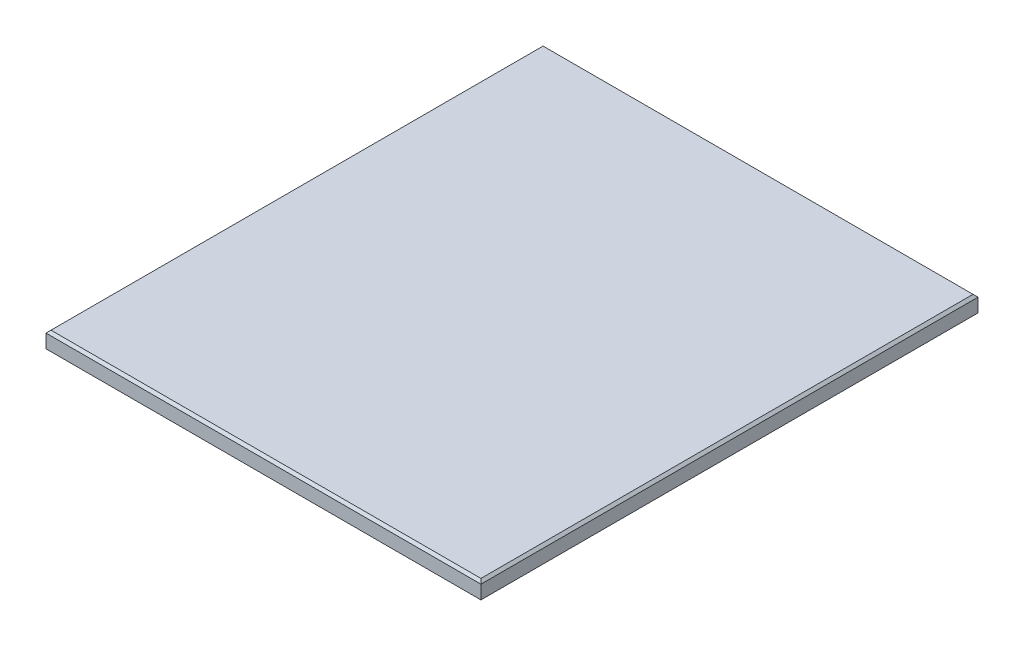
ISO-10303-21;
HEADER;
FILE_DESCRIPTION(('STEP AP214'),'2;1');
FILE_NAME('part.step','',(''),(''),'','','');
FILE_SCHEMA(('AUTOMOTIVE_DESIGN { 1 0 10303 214 1 1 1 1 }'));
ENDSEC;
DATA;
#1=APPLICATION_CONTEXT('core data for automotive mechanical design processes');
#2=APPLICATION_PROTOCOL_DEFINITION('international standard','automotive_design',2000,#1);
#3=PRODUCT_CONTEXT('',#1,'mechanical');
#4=PRODUCT('Part','Part','',(#3));
#5=PRODUCT_RELATED_PRODUCT_CATEGORY('part','',(#4));
#6=PRODUCT_DEFINITION_FORMATION('','',#4);
#7=PRODUCT_DEFINITION_CONTEXT('part definition',#1,'design');
#8=PRODUCT_DEFINITION('design','',#6,#7);
#9=PRODUCT_DEFINITION_SHAPE('','',#8);
#10=(LENGTH_UNIT() NAMED_UNIT(*) SI_UNIT(.MILLI.,.METRE.));
#11=(NAMED_UNIT(*) PLANE_ANGLE_UNIT() SI_UNIT($,.RADIAN.));
#12=(NAMED_UNIT(*) SI_UNIT($,.STERADIAN.) SOLID_ANGLE_UNIT());
#13=UNCERTAINTY_MEASURE_WITH_UNIT(LENGTH_MEASURE(1.E-05),#10,'distance_accuracy_value','');
#14=(GEOMETRIC_REPRESENTATION_CONTEXT(3) GLOBAL_UNCERTAINTY_ASSIGNED_CONTEXT((#13)) GLOBAL_UNIT_ASSIGNED_CONTEXT((#10,
#11,#12)) REPRESENTATION_CONTEXT('',''));
#15=CARTESIAN_POINT('',(0.,0.,0.));
#16=DIRECTION('',(0.,0.,1.));
#17=DIRECTION('',(1.,0.,0.));
#18=AXIS2_PLACEMENT_3D('',#15,#16,#17);
#19=CARTESIAN_POINT('',(0.,15.,0.));
#20=DIRECTION('',(1.,0.,0.));
#21=DIRECTION('',(0.,0.,-1.));
#22=AXIS2_PLACEMENT_3D('',#19,#20,#21);
#23=PLANE('',#22);
#24=DIRECTION('',(0.,-1.,0.));
#25=VECTOR('',#24,1.);
#26=CARTESIAN_POINT('',(0.,15.,0.));
#27=LINE('',#26,#25);
#28=CARTESIAN_POINT('',(0.,12.9999999999999,0.));
#29=VERTEX_POINT('',#28);
#30=CARTESIAN_POINT('',(0.,2.,0.));
#31=VERTEX_POINT('',#30);
#32=EDGE_CURVE('E141',#29,#31,#27,.T.);
#33=ORIENTED_EDGE('',*,*,#32,.T.);
#34=DIRECTION('',(0.,0.,1.));
#35=VECTOR('',#34,1.);
#36=CARTESIAN_POINT('',(0.,2.,0.));
#37=LINE('',#36,#35);
#38=CARTESIAN_POINT('',(0.,2.,400.));
#39=VERTEX_POINT('',#38);
#40=EDGE_CURVE('E150',#31,#39,#37,.T.);
#41=ORIENTED_EDGE('',*,*,#40,.T.);
#42=DIRECTION('',(0.,-1.,0.));
#43=VECTOR('',#42,1.);
#44=CARTESIAN_POINT('',(0.,15.,400.));
#45=LINE('',#44,#43);
#46=CARTESIAN_POINT('',(0.,12.9999999999999,400.));
#47=VERTEX_POINT('',#46);
#48=EDGE_CURVE('E119',#47,#39,#45,.T.);
#49=ORIENTED_EDGE('',*,*,#48,.F.);
#50=DIRECTION('',(0.,0.,-1.));
#51=VECTOR('',#50,1.);
#52=CARTESIAN_POINT('',(0.,12.9999999999999,0.));
#53=LINE('',#52,#51);
#54=EDGE_CURVE('E152',#47,#29,#53,.T.);
#55=ORIENTED_EDGE('',*,*,#54,.T.);
#56=EDGE_LOOP('',(#33,#41,#49,#55));
#57=FACE_BOUND('',#56,.T.);
#58=ADVANCED_FACE('F32',(#57),#23,.F.);
#59=CARTESIAN_POINT('',(0.,15.,400.));
#60=DIRECTION('',(0.,0.,-1.));
#61=DIRECTION('',(-1.,0.,0.));
#62=AXIS2_PLACEMENT_3D('',#59,#60,#61);
#63=PLANE('',#62);
#64=ORIENTED_EDGE('',*,*,#48,.T.);
#65=DIRECTION('',(1.,0.,0.));
#66=VECTOR('',#65,1.);
#67=CARTESIAN_POINT('',(0.,2.,400.));
#68=LINE('',#67,#66);
#69=CARTESIAN_POINT('',(350.,2.,400.));
#70=VERTEX_POINT('',#69);
#71=EDGE_CURVE('E118',#39,#70,#68,.T.);
#72=ORIENTED_EDGE('',*,*,#71,.T.);
#73=DIRECTION('',(0.,-1.,0.));
#74=VECTOR('',#73,1.);
#75=CARTESIAN_POINT('',(350.,15.,400.));
#76=LINE('',#75,#74);
#77=CARTESIAN_POINT('',(350.,12.9999999999999,400.));
#78=VERTEX_POINT('',#77);
#79=EDGE_CURVE('E101',#78,#70,#76,.T.);
#80=ORIENTED_EDGE('',*,*,#79,.F.);
#81=DIRECTION('',(-1.,0.,0.));
#82=VECTOR('',#81,1.);
#83=CARTESIAN_POINT('',(0.,12.9999999999999,400.));
#84=LINE('',#83,#82);
#85=EDGE_CURVE('E115',#78,#47,#84,.T.);
#86=ORIENTED_EDGE('',*,*,#85,.T.);
#87=EDGE_LOOP('',(#64,#72,#80,#86));
#88=FACE_BOUND('',#87,.T.);
#89=ADVANCED_FACE('F114',(#88),#63,.F.);
#90=CARTESIAN_POINT('',(350.,15.,0.));
#91=DIRECTION('',(-1.,0.,0.));
#92=DIRECTION('',(0.,0.,1.));
#93=AXIS2_PLACEMENT_3D('',#90,#91,#92);
#94=PLANE('',#93);
#95=ORIENTED_EDGE('',*,*,#79,.T.);
#96=DIRECTION('',(0.,0.,-1.));
#97=VECTOR('',#96,1.);
#98=CARTESIAN_POINT('',(350.,2.,0.));
#99=LINE('',#98,#97);
#100=CARTESIAN_POINT('',(350.,2.,0.));
#101=VERTEX_POINT('',#100);
#102=EDGE_CURVE('E107',#70,#101,#99,.T.);
#103=ORIENTED_EDGE('',*,*,#102,.T.);
#104=DIRECTION('',(0.,-1.,0.));
#105=VECTOR('',#104,1.);
#106=CARTESIAN_POINT('',(350.,15.,0.));
#107=LINE('',#106,#105);
#108=CARTESIAN_POINT('',(350.,12.9999999999999,0.));
#109=VERTEX_POINT('',#108);
#110=EDGE_CURVE('E103',#109,#101,#107,.T.);
#111=ORIENTED_EDGE('',*,*,#110,.F.);
#112=DIRECTION('',(0.,0.,1.));
#113=VECTOR('',#112,1.);
#114=CARTESIAN_POINT('',(350.,12.9999999999999,400.));
#115=LINE('',#114,#113);
#116=EDGE_CURVE('E98',#109,#78,#115,.T.);
#117=ORIENTED_EDGE('',*,*,#116,.T.);
#118=EDGE_LOOP('',(#95,#103,#111,#117));
#119=FACE_BOUND('',#118,.T.);
#120=ADVANCED_FACE('F100',(#119),#94,.F.);
#121=CARTESIAN_POINT('',(0.,15.,0.));
#122=DIRECTION('',(0.,0.,1.));
#123=DIRECTION('',(1.,0.,0.));
#124=AXIS2_PLACEMENT_3D('',#121,#122,#123);
#125=PLANE('',#124);
#126=ORIENTED_EDGE('',*,*,#110,.T.);
#127=DIRECTION('',(-1.,0.,0.));
#128=VECTOR('',#127,1.);
#129=CARTESIAN_POINT('',(0.,2.,0.));
#130=LINE('',#129,#128);
#131=EDGE_CURVE('E154',#101,#31,#130,.T.);
#132=ORIENTED_EDGE('',*,*,#131,.T.);
#133=ORIENTED_EDGE('',*,*,#32,.F.);
#134=DIRECTION('',(1.,0.,0.));
#135=VECTOR('',#134,1.);
#136=CARTESIAN_POINT('',(350.,12.9999999999999,0.));
#137=LINE('',#136,#135);
#138=EDGE_CURVE('E156',#29,#109,#137,.T.);
#139=ORIENTED_EDGE('',*,*,#138,.T.);
#140=EDGE_LOOP('',(#126,#132,#133,#139));
#141=FACE_BOUND('',#140,.T.);
#142=ADVANCED_FACE('F194',(#141),#125,.F.);
#143=CARTESIAN_POINT('',(0.,15.,0.));
#144=DIRECTION('',(0.,1.,0.));
#145=DIRECTION('',(0.,0.,1.));
#146=AXIS2_PLACEMENT_3D('',#143,#144,#145);
#147=PLANE('',#146);
#148=DIRECTION('',(0.,0.,-1.));
#149=VECTOR('',#148,1.);
#150=CARTESIAN_POINT('',(348.,15.,0.));
#151=LINE('',#150,#149);
#152=CARTESIAN_POINT('',(348.,15.,398.));
#153=VERTEX_POINT('',#152);
#154=CARTESIAN_POINT('',(348.,15.,2.00000000000006));
#155=VERTEX_POINT('',#154);
#156=EDGE_CURVE('E41',#153,#155,#151,.T.);
#157=ORIENTED_EDGE('',*,*,#156,.T.);
#158=DIRECTION('',(-1.,0.,0.));
#159=VECTOR('',#158,1.);
#160=CARTESIAN_POINT('',(0.,15.,2.00000000000006));
#161=LINE('',#160,#159);
#162=CARTESIAN_POINT('',(2.00000000000006,15.,2.00000000000006));
#163=VERTEX_POINT('',#162);
#164=EDGE_CURVE('E11',#155,#163,#161,.T.);
#165=ORIENTED_EDGE('',*,*,#164,.T.);
#166=DIRECTION('',(0.,0.,1.));
#167=VECTOR('',#166,1.);
#168=CARTESIAN_POINT('',(2.00000000000011,15.,400.));
#169=LINE('',#168,#167);
#170=CARTESIAN_POINT('',(2.00000000000011,15.,398.));
#171=VERTEX_POINT('',#170);
#172=EDGE_CURVE('E148',#163,#171,#169,.T.);
#173=ORIENTED_EDGE('',*,*,#172,.T.);
#174=DIRECTION('',(1.,0.,0.));
#175=VECTOR('',#174,1.);
#176=CARTESIAN_POINT('',(350.,15.,398.));
#177=LINE('',#176,#175);
#178=EDGE_CURVE('E52',#171,#153,#177,.T.);
#179=ORIENTED_EDGE('',*,*,#178,.T.);
#180=EDGE_LOOP('',(#157,#165,#173,#179));
#181=FACE_BOUND('',#180,.T.);
#182=ADVANCED_FACE('F200',(#181),#147,.T.);
#183=CARTESIAN_POINT('',(0.,0.,0.));
#184=DIRECTION('',(0.,1.,0.));
#185=DIRECTION('',(0.,0.,1.));
#186=AXIS2_PLACEMENT_3D('',#183,#184,#185);
#187=PLANE('',#186);
#188=DIRECTION('',(0.,0.,1.));
#189=VECTOR('',#188,1.);
#190=CARTESIAN_POINT('',(348.,0.,0.));
#191=LINE('',#190,#189);
#192=CARTESIAN_POINT('',(348.,0.,2.));
#193=VERTEX_POINT('',#192);
#194=CARTESIAN_POINT('',(348.,0.,398.));
#195=VERTEX_POINT('',#194);
#196=EDGE_CURVE('E161',#193,#195,#191,.T.);
#197=ORIENTED_EDGE('',*,*,#196,.T.);
#198=DIRECTION('',(-1.,0.,0.));
#199=VECTOR('',#198,1.);
#200=CARTESIAN_POINT('',(0.,0.,398.));
#201=LINE('',#200,#199);
#202=CARTESIAN_POINT('',(2.00000000000005,0.,398.));
#203=VERTEX_POINT('',#202);
#204=EDGE_CURVE('E108',#195,#203,#201,.T.);
#205=ORIENTED_EDGE('',*,*,#204,.T.);
#206=DIRECTION('',(0.,0.,-1.));
#207=VECTOR('',#206,1.);
#208=CARTESIAN_POINT('',(2.,0.,0.));
#209=LINE('',#208,#207);
#210=CARTESIAN_POINT('',(2.,0.,2.));
#211=VERTEX_POINT('',#210);
#212=EDGE_CURVE('E165',#203,#211,#209,.T.);
#213=ORIENTED_EDGE('',*,*,#212,.T.);
#214=DIRECTION('',(1.,0.,0.));
#215=VECTOR('',#214,1.);
#216=CARTESIAN_POINT('',(0.,0.,2.));
#217=LINE('',#216,#215);
#218=EDGE_CURVE('E163',#211,#193,#217,.T.);
#219=ORIENTED_EDGE('',*,*,#218,.T.);
#220=EDGE_LOOP('',(#197,#205,#213,#219));
#221=FACE_BOUND('',#220,.T.);
#222=ADVANCED_FACE('F202',(#221),#187,.F.);
#223=CARTESIAN_POINT('',(0.,2.,0.));
#224=DIRECTION('',(0.,0.707106781186547,0.707106781186547));
#225=DIRECTION('',(-1.,0.,0.));
#226=AXIS2_PLACEMENT_3D('',#223,#224,#225);
#227=PLANE('',#226);
#228=DIRECTION('',(-0.577350269189626,-0.577350269189626,0.577350269189626));
#229=VECTOR('',#228,1.);
#230=CARTESIAN_POINT('',(233.333333333333,-114.666666666667,116.666666666667));
#231=LINE('',#230,#229);
#232=EDGE_CURVE('E142',#193,#101,#231,.F.);
#233=ORIENTED_EDGE('',*,*,#232,.F.);
#234=ORIENTED_EDGE('',*,*,#218,.F.);
#235=DIRECTION('',(0.577350269189626,-0.577350269189626,0.577350269189626));
#236=VECTOR('',#235,1.);
#237=CARTESIAN_POINT('',(0.,2.,0.));
#238=LINE('',#237,#236);
#239=EDGE_CURVE('E138',#31,#211,#238,.T.);
#240=ORIENTED_EDGE('',*,*,#239,.F.);
#241=ORIENTED_EDGE('',*,*,#131,.F.);
#242=EDGE_LOOP('',(#233,#234,#240,#241));
#243=FACE_BOUND('',#242,.T.);
#244=ADVANCED_FACE('F181',(#243),#227,.F.);
#245=CARTESIAN_POINT('',(0.,2.,0.));
#246=DIRECTION('',(0.707106781186547,0.707106781186547,0.));
#247=DIRECTION('',(0.,0.,1.));
#248=AXIS2_PLACEMENT_3D('',#245,#246,#247);
#249=PLANE('',#248);
#250=ORIENTED_EDGE('',*,*,#239,.T.);
#251=ORIENTED_EDGE('',*,*,#212,.F.);
#252=DIRECTION('',(-0.577350269189626,0.577350269189626,0.577350269189626));
#253=VECTOR('',#252,1.);
#254=CARTESIAN_POINT('',(133.333333333333,-131.333333333333,266.666666666667));
#255=LINE('',#254,#253);
#256=EDGE_CURVE('E129',#39,#203,#255,.F.);
#257=ORIENTED_EDGE('',*,*,#256,.F.);
#258=ORIENTED_EDGE('',*,*,#40,.F.);
#259=EDGE_LOOP('',(#250,#251,#257,#258));
#260=FACE_BOUND('',#259,.T.);
#261=ADVANCED_FACE('F185',(#260),#249,.F.);
#262=CARTESIAN_POINT('',(350.,2.,0.));
#263=DIRECTION('',(-0.707106781186547,0.707106781186547,0.));
#264=DIRECTION('',(0.,0.,-1.));
#265=AXIS2_PLACEMENT_3D('',#262,#263,#264);
#266=PLANE('',#265);
#267=ORIENTED_EDGE('',*,*,#232,.T.);
#268=ORIENTED_EDGE('',*,*,#102,.F.);
#269=DIRECTION('',(-0.577350269189626,-0.577350269189626,-0.577350269189626));
#270=VECTOR('',#269,1.);
#271=CARTESIAN_POINT('',(216.666666666667,-131.333333333333,266.666666666667));
#272=LINE('',#271,#270);
#273=EDGE_CURVE('E128',#195,#70,#272,.F.);
#274=ORIENTED_EDGE('',*,*,#273,.F.);
#275=ORIENTED_EDGE('',*,*,#196,.F.);
#276=EDGE_LOOP('',(#267,#268,#274,#275));
#277=FACE_BOUND('',#276,.T.);
#278=ADVANCED_FACE('F193',(#277),#266,.F.);
#279=CARTESIAN_POINT('',(0.,2.,400.));
#280=DIRECTION('',(0.,0.707106781186547,-0.707106781186547));
#281=DIRECTION('',(1.,0.,0.));
#282=AXIS2_PLACEMENT_3D('',#279,#280,#281);
#283=PLANE('',#282);
#284=ORIENTED_EDGE('',*,*,#256,.T.);
#285=ORIENTED_EDGE('',*,*,#204,.F.);
#286=ORIENTED_EDGE('',*,*,#273,.T.);
#287=ORIENTED_EDGE('',*,*,#71,.F.);
#288=EDGE_LOOP('',(#284,#285,#286,#287));
#289=FACE_BOUND('',#288,.T.);
#290=ADVANCED_FACE('F188',(#289),#283,.F.);
#291=CARTESIAN_POINT('',(0.,15.,398.));
#292=DIRECTION('',(0.,0.707106781186548,0.707106781186548));
#293=DIRECTION('',(-1.,0.,0.));
#294=AXIS2_PLACEMENT_3D('',#291,#292,#293);
#295=PLANE('',#294);
#296=DIRECTION('',(0.577350269189626,0.577350269189626,-0.577350269189626));
#297=VECTOR('',#296,1.);
#298=CARTESIAN_POINT('',(134.666666666667,147.666666666667,265.333333333333));
#299=LINE('',#298,#297);
#300=EDGE_CURVE('E124',#47,#171,#299,.T.);
#301=ORIENTED_EDGE('',*,*,#300,.F.);
#302=ORIENTED_EDGE('',*,*,#85,.F.);
#303=DIRECTION('',(-0.577350269189615,0.577350269189631,-0.577350269189631));
#304=VECTOR('',#303,1.);
#305=CARTESIAN_POINT('',(232.000000000004,130.999999999999,282.000000000001));
#306=LINE('',#305,#304);
#307=EDGE_CURVE('E36',#153,#78,#306,.F.);
#308=ORIENTED_EDGE('',*,*,#307,.F.);
#309=ORIENTED_EDGE('',*,*,#178,.F.);
#310=EDGE_LOOP('',(#301,#302,#308,#309));
#311=FACE_BOUND('',#310,.T.);
#312=ADVANCED_FACE('F34',(#311),#295,.T.);
#313=CARTESIAN_POINT('',(348.,15.,0.));
#314=DIRECTION('',(0.707106781186557,0.707106781186538,0.));
#315=DIRECTION('',(0.,0.,1.));
#316=AXIS2_PLACEMENT_3D('',#313,#314,#315);
#317=PLANE('',#316);
#318=ORIENTED_EDGE('',*,*,#307,.T.);
#319=ORIENTED_EDGE('',*,*,#116,.F.);
#320=DIRECTION('',(-0.577350269189615,0.577350269189631,0.577350269189631));
#321=VECTOR('',#320,1.);
#322=CARTESIAN_POINT('',(348.666666666667,14.3333333333333,1.33333333333334));
#323=LINE('',#322,#321);
#324=EDGE_CURVE('E131',#155,#109,#323,.F.);
#325=ORIENTED_EDGE('',*,*,#324,.F.);
#326=ORIENTED_EDGE('',*,*,#156,.F.);
#327=EDGE_LOOP('',(#318,#319,#325,#326));
#328=FACE_BOUND('',#327,.T.);
#329=ADVANCED_FACE('F127',(#328),#317,.T.);
#330=CARTESIAN_POINT('',(2.00000000000006,15.,0.));
#331=DIRECTION('',(-0.707106781186548,0.707106781186548,0.));
#332=DIRECTION('',(0.,0.,-1.));
#333=AXIS2_PLACEMENT_3D('',#330,#331,#332);
#334=PLANE('',#333);
#335=ORIENTED_EDGE('',*,*,#300,.T.);
#336=ORIENTED_EDGE('',*,*,#172,.F.);
#337=DIRECTION('',(-0.577350269189626,-0.577350269189626,-0.577350269189626));
#338=VECTOR('',#337,1.);
#339=CARTESIAN_POINT('',(1.33333333333337,14.3333333333333,1.33333333333337));
#340=LINE('',#339,#338);
#341=EDGE_CURVE('E134',#29,#163,#340,.F.);
#342=ORIENTED_EDGE('',*,*,#341,.F.);
#343=ORIENTED_EDGE('',*,*,#54,.F.);
#344=EDGE_LOOP('',(#335,#336,#342,#343));
#345=FACE_BOUND('',#344,.T.);
#346=ADVANCED_FACE('F199',(#345),#334,.T.);
#347=CARTESIAN_POINT('',(0.,15.,2.00000000000006));
#348=DIRECTION('',(0.,0.707106781186548,-0.707106781186548));
#349=DIRECTION('',(1.,0.,0.));
#350=AXIS2_PLACEMENT_3D('',#347,#348,#349);
#351=PLANE('',#350);
#352=ORIENTED_EDGE('',*,*,#324,.T.);
#353=ORIENTED_EDGE('',*,*,#138,.F.);
#354=ORIENTED_EDGE('',*,*,#341,.T.);
#355=ORIENTED_EDGE('',*,*,#164,.F.);
#356=EDGE_LOOP('',(#352,#353,#354,#355));
#357=FACE_BOUND('',#356,.T.);
#358=ADVANCED_FACE('F197',(#357),#351,.T.);
#359=CLOSED_SHELL('',(#58,#89,#120,#142,#182,#222,#244,#261,#278,#290,#312,#329,#346,#358));
#360=MANIFOLD_SOLID_BREP('B2',#359);
#361=ADVANCED_BREP_SHAPE_REPRESENTATION('',(#18,#360),#14);
#362=SHAPE_DEFINITION_REPRESENTATION(#9,#361);
ENDSEC;
END-ISO-10303-21;
